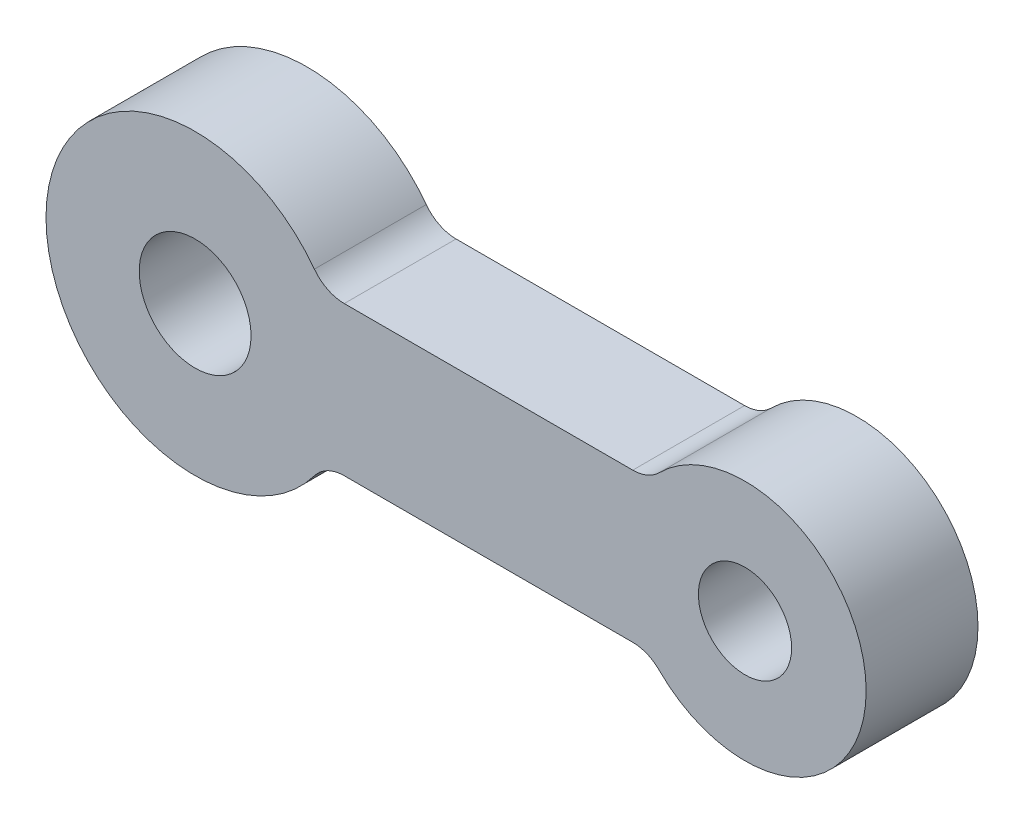
ISO-10303-21;
HEADER;
FILE_DESCRIPTION(('STEP AP214'),'2;1');
FILE_NAME('part.step','',(''),(''),'','','');
FILE_SCHEMA(('AUTOMOTIVE_DESIGN { 1 0 10303 214 1 1 1 1 }'));
ENDSEC;
DATA;
#1=APPLICATION_CONTEXT('core data for automotive mechanical design processes');
#2=APPLICATION_PROTOCOL_DEFINITION('international standard','automotive_design',2000,#1);
#3=PRODUCT_CONTEXT('',#1,'mechanical');
#4=PRODUCT('Part','Part','',(#3));
#5=PRODUCT_RELATED_PRODUCT_CATEGORY('part','',(#4));
#6=PRODUCT_DEFINITION_FORMATION('','',#4);
#7=PRODUCT_DEFINITION_CONTEXT('part definition',#1,'design');
#8=PRODUCT_DEFINITION('design','',#6,#7);
#9=PRODUCT_DEFINITION_SHAPE('','',#8);
#10=(LENGTH_UNIT() NAMED_UNIT(*) SI_UNIT(.MILLI.,.METRE.));
#11=(NAMED_UNIT(*) PLANE_ANGLE_UNIT() SI_UNIT($,.RADIAN.));
#12=(NAMED_UNIT(*) SI_UNIT($,.STERADIAN.) SOLID_ANGLE_UNIT());
#13=UNCERTAINTY_MEASURE_WITH_UNIT(LENGTH_MEASURE(1.E-05),#10,'distance_accuracy_value','');
#14=(GEOMETRIC_REPRESENTATION_CONTEXT(3) GLOBAL_UNCERTAINTY_ASSIGNED_CONTEXT((#13)) GLOBAL_UNIT_ASSIGNED_CONTEXT((#10,
#11,#12)) REPRESENTATION_CONTEXT('',''));
#15=CARTESIAN_POINT('',(0.,0.,0.));
#16=DIRECTION('',(0.,0.,1.));
#17=DIRECTION('',(1.,0.,0.));
#18=AXIS2_PLACEMENT_3D('',#15,#16,#17);
#19=CARTESIAN_POINT('',(0.,0.,6.));
#20=DIRECTION('',(0.,0.,-1.));
#21=DIRECTION('',(-1.,0.,0.));
#22=AXIS2_PLACEMENT_3D('',#19,#20,#21);
#23=PLANE('',#22);
#24=DIRECTION('',(-1.,0.,0.));
#25=VECTOR('',#24,1.);
#26=CARTESIAN_POINT('',(6.92820323027551,4.,6.));
#27=LINE('',#26,#25);
#28=CARTESIAN_POINT('',(23.4792027106039,4.,6.));
#29=VERTEX_POINT('',#28);
#30=CARTESIAN_POINT('',(8.,4.,6.));
#31=VERTEX_POINT('',#30);
#32=EDGE_CURVE('E134',#29,#31,#27,.T.);
#33=ORIENTED_EDGE('',*,*,#32,.T.);
#34=CARTESIAN_POINT('',(8.,6.,6.));
#35=DIRECTION('',(0.,0.,-1.));
#36=DIRECTION('',(-1.,0.,0.));
#37=AXIS2_PLACEMENT_3D('',#34,#35,#36);
#38=CIRCLE('',#37,2.);
#39=CARTESIAN_POINT('',(6.4,4.8,6.));
#40=VERTEX_POINT('',#39);
#41=EDGE_CURVE('E110',#31,#40,#38,.T.);
#42=ORIENTED_EDGE('',*,*,#41,.T.);
#43=CARTESIAN_POINT('',(0.,0.,6.));
#44=DIRECTION('',(0.,0.,1.));
#45=DIRECTION('',(-1.,0.,0.));
#46=AXIS2_PLACEMENT_3D('',#43,#44,#45);
#47=CIRCLE('',#46,8.);
#48=CARTESIAN_POINT('',(6.4,-4.8,6.));
#49=VERTEX_POINT('',#48);
#50=EDGE_CURVE('E118',#40,#49,#47,.T.);
#51=ORIENTED_EDGE('',*,*,#50,.T.);
#52=CARTESIAN_POINT('',(8.,-6.,6.));
#53=DIRECTION('',(0.,0.,-1.));
#54=DIRECTION('',(-1.,0.,0.));
#55=AXIS2_PLACEMENT_3D('',#52,#53,#54);
#56=CIRCLE('',#55,2.);
#57=CARTESIAN_POINT('',(8.,-4.,6.));
#58=VERTEX_POINT('',#57);
#59=EDGE_CURVE('E11',#49,#58,#56,.T.);
#60=ORIENTED_EDGE('',*,*,#59,.T.);
#61=DIRECTION('',(1.,0.,0.));
#62=VECTOR('',#61,1.);
#63=CARTESIAN_POINT('',(6.92820323027551,-4.,6.));
#64=LINE('',#63,#62);
#65=CARTESIAN_POINT('',(23.4792027106039,-4.,6.));
#66=VERTEX_POINT('',#65);
#67=EDGE_CURVE('E169',#58,#66,#64,.T.);
#68=ORIENTED_EDGE('',*,*,#67,.T.);
#69=CARTESIAN_POINT('',(23.4792027106039,-6.,6.));
#70=DIRECTION('',(0.,0.,-1.));
#71=DIRECTION('',(-1.,0.,0.));
#72=AXIS2_PLACEMENT_3D('',#69,#70,#71);
#73=CIRCLE('',#72,2.);
#74=CARTESIAN_POINT('',(24.8958608963441,-4.58823529411765,6.));
#75=VERTEX_POINT('',#74);
#76=EDGE_CURVE('E161',#66,#75,#73,.T.);
#77=ORIENTED_EDGE('',*,*,#76,.T.);
#78=CARTESIAN_POINT('',(29.5,0.,6.));
#79=DIRECTION('',(0.,0.,1.));
#80=DIRECTION('',(-1.,0.,0.));
#81=AXIS2_PLACEMENT_3D('',#78,#79,#80);
#82=CIRCLE('',#81,6.5);
#83=CARTESIAN_POINT('',(24.8958608963441,4.58823529411765,6.));
#84=VERTEX_POINT('',#83);
#85=EDGE_CURVE('E167',#75,#84,#82,.T.);
#86=ORIENTED_EDGE('',*,*,#85,.T.);
#87=CARTESIAN_POINT('',(23.4792027106039,6.,6.));
#88=DIRECTION('',(0.,0.,-1.));
#89=DIRECTION('',(-1.,0.,0.));
#90=AXIS2_PLACEMENT_3D('',#87,#88,#89);
#91=CIRCLE('',#90,2.);
#92=EDGE_CURVE('E157',#84,#29,#91,.T.);
#93=ORIENTED_EDGE('',*,*,#92,.T.);
#94=EDGE_LOOP('',(#33,#42,#51,#60,#68,#77,#86,#93));
#95=FACE_BOUND('',#94,.T.);
#96=CARTESIAN_POINT('',(0.,0.,6.));
#97=DIRECTION('',(0.,0.,1.));
#98=DIRECTION('',(1.,0.,0.));
#99=AXIS2_PLACEMENT_3D('',#96,#97,#98);
#100=CIRCLE('',#99,3.);
#101=CARTESIAN_POINT('',(3.,0.,6.));
#102=VERTEX_POINT('',#101);
#103=EDGE_CURVE('E126',#102,#102,#100,.T.);
#104=ORIENTED_EDGE('',*,*,#103,.F.);
#105=EDGE_LOOP('',(#104));
#106=FACE_BOUND('',#105,.T.);
#107=CARTESIAN_POINT('',(29.5,0.,6.));
#108=DIRECTION('',(0.,0.,1.));
#109=DIRECTION('',(1.,0.,0.));
#110=AXIS2_PLACEMENT_3D('',#107,#108,#109);
#111=CIRCLE('',#110,2.5);
#112=CARTESIAN_POINT('',(32.,0.,6.));
#113=VERTEX_POINT('',#112);
#114=EDGE_CURVE('E184',#113,#113,#111,.T.);
#115=ORIENTED_EDGE('',*,*,#114,.F.);
#116=EDGE_LOOP('',(#115));
#117=FACE_BOUND('',#116,.T.);
#118=ADVANCED_FACE('F35',(#95,#106,#117),#23,.F.);
#119=CARTESIAN_POINT('',(0.,0.,0.));
#120=DIRECTION('',(0.,0.,-1.));
#121=DIRECTION('',(-1.,0.,0.));
#122=AXIS2_PLACEMENT_3D('',#119,#120,#121);
#123=PLANE('',#122);
#124=CARTESIAN_POINT('',(0.,0.,0.));
#125=DIRECTION('',(0.,0.,1.));
#126=DIRECTION('',(1.,0.,0.));
#127=AXIS2_PLACEMENT_3D('',#124,#125,#126);
#128=CIRCLE('',#127,3.);
#129=CARTESIAN_POINT('',(3.,0.,0.));
#130=VERTEX_POINT('',#129);
#131=EDGE_CURVE('E131',#130,#130,#128,.T.);
#132=ORIENTED_EDGE('',*,*,#131,.T.);
#133=EDGE_LOOP('',(#132));
#134=FACE_BOUND('',#133,.T.);
#135=CARTESIAN_POINT('',(0.,0.,0.));
#136=DIRECTION('',(0.,0.,1.));
#137=DIRECTION('',(-1.,0.,0.));
#138=AXIS2_PLACEMENT_3D('',#135,#136,#137);
#139=CIRCLE('',#138,8.);
#140=CARTESIAN_POINT('',(6.4,4.8,0.));
#141=VERTEX_POINT('',#140);
#142=CARTESIAN_POINT('',(6.4,-4.8,0.));
#143=VERTEX_POINT('',#142);
#144=EDGE_CURVE('E116',#141,#143,#139,.T.);
#145=ORIENTED_EDGE('',*,*,#144,.F.);
#146=CARTESIAN_POINT('',(8.,6.,0.));
#147=DIRECTION('',(0.,0.,-1.));
#148=DIRECTION('',(-1.,0.,0.));
#149=AXIS2_PLACEMENT_3D('',#146,#147,#148);
#150=CIRCLE('',#149,2.);
#151=CARTESIAN_POINT('',(8.,4.,0.));
#152=VERTEX_POINT('',#151);
#153=EDGE_CURVE('E100',#141,#152,#150,.F.);
#154=ORIENTED_EDGE('',*,*,#153,.T.);
#155=DIRECTION('',(-1.,0.,0.));
#156=VECTOR('',#155,1.);
#157=CARTESIAN_POINT('',(6.92820323027551,4.,0.));
#158=LINE('',#157,#156);
#159=CARTESIAN_POINT('',(23.4792027106039,4.,0.));
#160=VERTEX_POINT('',#159);
#161=EDGE_CURVE('E139',#160,#152,#158,.T.);
#162=ORIENTED_EDGE('',*,*,#161,.F.);
#163=CARTESIAN_POINT('',(23.4792027106039,6.,0.));
#164=DIRECTION('',(0.,0.,-1.));
#165=DIRECTION('',(-1.,0.,0.));
#166=AXIS2_PLACEMENT_3D('',#163,#164,#165);
#167=CIRCLE('',#166,2.);
#168=CARTESIAN_POINT('',(24.8958608963441,4.58823529411765,0.));
#169=VERTEX_POINT('',#168);
#170=EDGE_CURVE('E155',#160,#169,#167,.F.);
#171=ORIENTED_EDGE('',*,*,#170,.T.);
#172=CARTESIAN_POINT('',(29.5,0.,0.));
#173=DIRECTION('',(0.,0.,1.));
#174=DIRECTION('',(-1.,0.,0.));
#175=AXIS2_PLACEMENT_3D('',#172,#173,#174);
#176=CIRCLE('',#175,6.5);
#177=CARTESIAN_POINT('',(24.8958608963441,-4.58823529411765,0.));
#178=VERTEX_POINT('',#177);
#179=EDGE_CURVE('E128',#178,#169,#176,.T.);
#180=ORIENTED_EDGE('',*,*,#179,.F.);
#181=CARTESIAN_POINT('',(23.4792027106039,-6.,0.));
#182=DIRECTION('',(0.,0.,-1.));
#183=DIRECTION('',(-1.,0.,0.));
#184=AXIS2_PLACEMENT_3D('',#181,#182,#183);
#185=CIRCLE('',#184,2.);
#186=CARTESIAN_POINT('',(23.4792027106039,-4.,0.));
#187=VERTEX_POINT('',#186);
#188=EDGE_CURVE('E159',#178,#187,#185,.F.);
#189=ORIENTED_EDGE('',*,*,#188,.T.);
#190=DIRECTION('',(1.,0.,0.));
#191=VECTOR('',#190,1.);
#192=CARTESIAN_POINT('',(6.92820323027551,-4.,0.));
#193=LINE('',#192,#191);
#194=CARTESIAN_POINT('',(8.,-4.,0.));
#195=VERTEX_POINT('',#194);
#196=EDGE_CURVE('E125',#195,#187,#193,.T.);
#197=ORIENTED_EDGE('',*,*,#196,.F.);
#198=CARTESIAN_POINT('',(8.,-6.,0.));
#199=DIRECTION('',(0.,0.,-1.));
#200=DIRECTION('',(-1.,0.,0.));
#201=AXIS2_PLACEMENT_3D('',#198,#199,#200);
#202=CIRCLE('',#201,2.);
#203=EDGE_CURVE('E43',#195,#143,#202,.F.);
#204=ORIENTED_EDGE('',*,*,#203,.T.);
#205=EDGE_LOOP('',(#145,#154,#162,#171,#180,#189,#197,#204));
#206=FACE_BOUND('',#205,.T.);
#207=CARTESIAN_POINT('',(29.5,0.,0.));
#208=DIRECTION('',(0.,0.,1.));
#209=DIRECTION('',(1.,0.,0.));
#210=AXIS2_PLACEMENT_3D('',#207,#208,#209);
#211=CIRCLE('',#210,2.5);
#212=CARTESIAN_POINT('',(32.,0.,0.));
#213=VERTEX_POINT('',#212);
#214=EDGE_CURVE('E186',#213,#213,#211,.T.);
#215=ORIENTED_EDGE('',*,*,#214,.T.);
#216=EDGE_LOOP('',(#215));
#217=FACE_BOUND('',#216,.T.);
#218=ADVANCED_FACE('F122',(#134,#206,#217),#123,.T.);
#219=CARTESIAN_POINT('',(0.,0.,6.));
#220=DIRECTION('',(0.,0.,-1.));
#221=DIRECTION('',(-1.,0.,0.));
#222=AXIS2_PLACEMENT_3D('',#219,#220,#221);
#223=CYLINDRICAL_SURFACE('',#222,8.);
#224=ORIENTED_EDGE('',*,*,#50,.F.);
#225=DIRECTION('',(0.,0.,-1.));
#226=VECTOR('',#225,1.);
#227=CARTESIAN_POINT('',(6.4,4.8,6.));
#228=LINE('',#227,#226);
#229=EDGE_CURVE('E104',#40,#141,#228,.T.);
#230=ORIENTED_EDGE('',*,*,#229,.T.);
#231=ORIENTED_EDGE('',*,*,#144,.T.);
#232=DIRECTION('',(0.,0.,-1.));
#233=VECTOR('',#232,1.);
#234=CARTESIAN_POINT('',(6.4,-4.8,6.));
#235=LINE('',#234,#233);
#236=EDGE_CURVE('E120',#143,#49,#235,.F.);
#237=ORIENTED_EDGE('',*,*,#236,.T.);
#238=EDGE_LOOP('',(#224,#230,#231,#237));
#239=FACE_BOUND('',#238,.T.);
#240=ADVANCED_FACE('F115',(#239),#223,.T.);
#241=CARTESIAN_POINT('',(6.92820323027551,-4.,6.));
#242=DIRECTION('',(0.,1.,0.));
#243=DIRECTION('',(-1.,0.,0.));
#244=AXIS2_PLACEMENT_3D('',#241,#242,#243);
#245=PLANE('',#244);
#246=ORIENTED_EDGE('',*,*,#196,.T.);
#247=DIRECTION('',(0.,0.,1.));
#248=VECTOR('',#247,1.);
#249=CARTESIAN_POINT('',(23.4792027106039,-4.,6.));
#250=LINE('',#249,#248);
#251=EDGE_CURVE('E50',#187,#66,#250,.T.);
#252=ORIENTED_EDGE('',*,*,#251,.T.);
#253=ORIENTED_EDGE('',*,*,#67,.F.);
#254=DIRECTION('',(0.,0.,1.));
#255=VECTOR('',#254,1.);
#256=CARTESIAN_POINT('',(8.,-4.,0.));
#257=LINE('',#256,#255);
#258=EDGE_CURVE('E150',#58,#195,#257,.F.);
#259=ORIENTED_EDGE('',*,*,#258,.T.);
#260=EDGE_LOOP('',(#246,#252,#253,#259));
#261=FACE_BOUND('',#260,.T.);
#262=ADVANCED_FACE('F177',(#261),#245,.F.);
#263=CARTESIAN_POINT('',(29.5,0.,6.));
#264=DIRECTION('',(0.,0.,-1.));
#265=DIRECTION('',(-1.,0.,0.));
#266=AXIS2_PLACEMENT_3D('',#263,#264,#265);
#267=CYLINDRICAL_SURFACE('',#266,6.5);
#268=ORIENTED_EDGE('',*,*,#179,.T.);
#269=DIRECTION('',(0.,0.,-1.));
#270=VECTOR('',#269,1.);
#271=CARTESIAN_POINT('',(24.8958608963441,4.58823529411765,6.));
#272=LINE('',#271,#270);
#273=EDGE_CURVE('E148',#169,#84,#272,.F.);
#274=ORIENTED_EDGE('',*,*,#273,.T.);
#275=ORIENTED_EDGE('',*,*,#85,.F.);
#276=DIRECTION('',(0.,0.,-1.));
#277=VECTOR('',#276,1.);
#278=CARTESIAN_POINT('',(24.8958608963441,-4.58823529411765,6.));
#279=LINE('',#278,#277);
#280=EDGE_CURVE('E145',#75,#178,#279,.T.);
#281=ORIENTED_EDGE('',*,*,#280,.T.);
#282=EDGE_LOOP('',(#268,#274,#275,#281));
#283=FACE_BOUND('',#282,.T.);
#284=ADVANCED_FACE('F173',(#283),#267,.T.);
#285=CARTESIAN_POINT('',(6.92820323027551,4.,6.));
#286=DIRECTION('',(0.,-1.,0.));
#287=DIRECTION('',(0.,0.,-1.));
#288=AXIS2_PLACEMENT_3D('',#285,#286,#287);
#289=PLANE('',#288);
#290=ORIENTED_EDGE('',*,*,#161,.T.);
#291=DIRECTION('',(0.,0.,1.));
#292=VECTOR('',#291,1.);
#293=CARTESIAN_POINT('',(8.,4.,6.));
#294=LINE('',#293,#292);
#295=EDGE_CURVE('E105',#152,#31,#294,.T.);
#296=ORIENTED_EDGE('',*,*,#295,.T.);
#297=ORIENTED_EDGE('',*,*,#32,.F.);
#298=DIRECTION('',(0.,0.,1.));
#299=VECTOR('',#298,1.);
#300=CARTESIAN_POINT('',(23.4792027106039,4.,0.));
#301=LINE('',#300,#299);
#302=EDGE_CURVE('E119',#29,#160,#301,.F.);
#303=ORIENTED_EDGE('',*,*,#302,.T.);
#304=EDGE_LOOP('',(#290,#296,#297,#303));
#305=FACE_BOUND('',#304,.T.);
#306=ADVANCED_FACE('F206',(#305),#289,.F.);
#307=CARTESIAN_POINT('',(0.,0.,6.));
#308=DIRECTION('',(0.,0.,-1.));
#309=DIRECTION('',(-1.,0.,0.));
#310=AXIS2_PLACEMENT_3D('',#307,#308,#309);
#311=CYLINDRICAL_SURFACE('',#310,3.);
#312=ORIENTED_EDGE('',*,*,#103,.T.);
#313=EDGE_LOOP('',(#312));
#314=FACE_BOUND('',#313,.T.);
#315=ORIENTED_EDGE('',*,*,#131,.F.);
#316=EDGE_LOOP('',(#315));
#317=FACE_BOUND('',#316,.T.);
#318=ADVANCED_FACE('F203',(#314,#317),#311,.F.);
#319=CARTESIAN_POINT('',(29.5,0.,6.));
#320=DIRECTION('',(0.,0.,-1.));
#321=DIRECTION('',(-1.,0.,0.));
#322=AXIS2_PLACEMENT_3D('',#319,#320,#321);
#323=CYLINDRICAL_SURFACE('',#322,2.5);
#324=ORIENTED_EDGE('',*,*,#114,.T.);
#325=EDGE_LOOP('',(#324));
#326=FACE_BOUND('',#325,.T.);
#327=ORIENTED_EDGE('',*,*,#214,.F.);
#328=EDGE_LOOP('',(#327));
#329=FACE_BOUND('',#328,.T.);
#330=ADVANCED_FACE('F192',(#326,#329),#323,.F.);
#331=CARTESIAN_POINT('',(8.,6.,6.));
#332=DIRECTION('',(0.,0.,-1.));
#333=DIRECTION('',(-1.,0.,0.));
#334=AXIS2_PLACEMENT_3D('',#331,#332,#333);
#335=CYLINDRICAL_SURFACE('',#334,2.);
#336=ORIENTED_EDGE('',*,*,#41,.F.);
#337=ORIENTED_EDGE('',*,*,#295,.F.);
#338=ORIENTED_EDGE('',*,*,#153,.F.);
#339=ORIENTED_EDGE('',*,*,#229,.F.);
#340=EDGE_LOOP('',(#336,#337,#338,#339));
#341=FACE_BOUND('',#340,.T.);
#342=ADVANCED_FACE('F103',(#341),#335,.F.);
#343=CARTESIAN_POINT('',(23.4792027106039,6.,6.));
#344=DIRECTION('',(0.,0.,-1.));
#345=DIRECTION('',(-1.,0.,0.));
#346=AXIS2_PLACEMENT_3D('',#343,#344,#345);
#347=CYLINDRICAL_SURFACE('',#346,2.);
#348=ORIENTED_EDGE('',*,*,#92,.F.);
#349=ORIENTED_EDGE('',*,*,#273,.F.);
#350=ORIENTED_EDGE('',*,*,#170,.F.);
#351=ORIENTED_EDGE('',*,*,#302,.F.);
#352=EDGE_LOOP('',(#348,#349,#350,#351));
#353=FACE_BOUND('',#352,.T.);
#354=ADVANCED_FACE('F218',(#353),#347,.F.);
#355=CARTESIAN_POINT('',(23.4792027106039,-6.,6.));
#356=DIRECTION('',(0.,0.,-1.));
#357=DIRECTION('',(-1.,0.,0.));
#358=AXIS2_PLACEMENT_3D('',#355,#356,#357);
#359=CYLINDRICAL_SURFACE('',#358,2.);
#360=ORIENTED_EDGE('',*,*,#76,.F.);
#361=ORIENTED_EDGE('',*,*,#251,.F.);
#362=ORIENTED_EDGE('',*,*,#188,.F.);
#363=ORIENTED_EDGE('',*,*,#280,.F.);
#364=EDGE_LOOP('',(#360,#361,#362,#363));
#365=FACE_BOUND('',#364,.T.);
#366=ADVANCED_FACE('F176',(#365),#359,.F.);
#367=CARTESIAN_POINT('',(8.,-6.,6.));
#368=DIRECTION('',(0.,0.,-1.));
#369=DIRECTION('',(-1.,0.,0.));
#370=AXIS2_PLACEMENT_3D('',#367,#368,#369);
#371=CYLINDRICAL_SURFACE('',#370,2.);
#372=ORIENTED_EDGE('',*,*,#59,.F.);
#373=ORIENTED_EDGE('',*,*,#236,.F.);
#374=ORIENTED_EDGE('',*,*,#203,.F.);
#375=ORIENTED_EDGE('',*,*,#258,.F.);
#376=EDGE_LOOP('',(#372,#373,#374,#375));
#377=FACE_BOUND('',#376,.T.);
#378=ADVANCED_FACE('F37',(#377),#371,.F.);
#379=CLOSED_SHELL('',(#118,#218,#240,#262,#284,#306,#318,#330,#342,#354,#366,#378));
#380=MANIFOLD_SOLID_BREP('B2',#379);
#381=ADVANCED_BREP_SHAPE_REPRESENTATION('',(#18,#380),#14);
#382=SHAPE_DEFINITION_REPRESENTATION(#9,#381);
ENDSEC;
END-ISO-10303-21;
